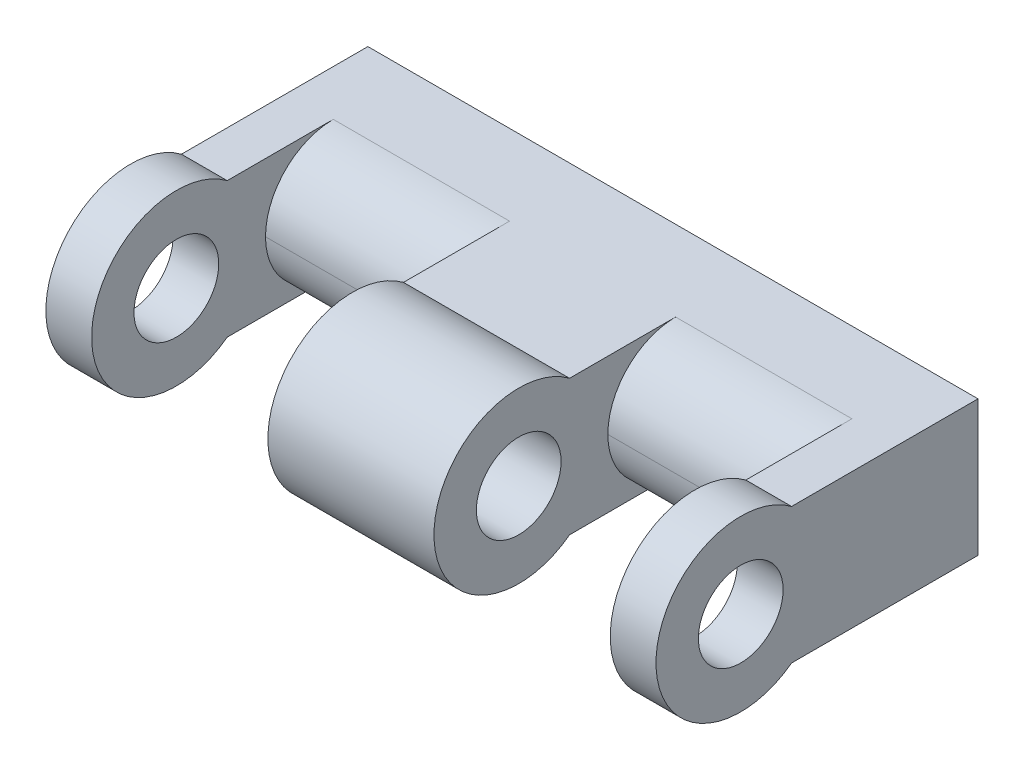
ISO-10303-21;
HEADER;
FILE_DESCRIPTION(('STEP AP214'),'2;1');
FILE_NAME('part.step','',(''),(''),'','','');
FILE_SCHEMA(('AUTOMOTIVE_DESIGN { 1 0 10303 214 1 1 1 1 }'));
ENDSEC;
DATA;
#1=APPLICATION_CONTEXT('core data for automotive mechanical design processes');
#2=APPLICATION_PROTOCOL_DEFINITION('international standard','automotive_design',2000,#1);
#3=PRODUCT_CONTEXT('',#1,'mechanical');
#4=PRODUCT('Part','Part','',(#3));
#5=PRODUCT_RELATED_PRODUCT_CATEGORY('part','',(#4));
#6=PRODUCT_DEFINITION_FORMATION('','',#4);
#7=PRODUCT_DEFINITION_CONTEXT('part definition',#1,'design');
#8=PRODUCT_DEFINITION('design','',#6,#7);
#9=PRODUCT_DEFINITION_SHAPE('','',#8);
#10=(LENGTH_UNIT() NAMED_UNIT(*) SI_UNIT(.MILLI.,.METRE.));
#11=(NAMED_UNIT(*) PLANE_ANGLE_UNIT() SI_UNIT($,.RADIAN.));
#12=(NAMED_UNIT(*) SI_UNIT($,.STERADIAN.) SOLID_ANGLE_UNIT());
#13=UNCERTAINTY_MEASURE_WITH_UNIT(LENGTH_MEASURE(1.E-05),#10,'distance_accuracy_value','');
#14=(GEOMETRIC_REPRESENTATION_CONTEXT(3) GLOBAL_UNCERTAINTY_ASSIGNED_CONTEXT((#13)) GLOBAL_UNIT_ASSIGNED_CONTEXT((#10,
#11,#12)) REPRESENTATION_CONTEXT('',''));
#15=CARTESIAN_POINT('',(0.,0.,0.));
#16=DIRECTION('',(0.,0.,1.));
#17=DIRECTION('',(1.,0.,0.));
#18=AXIS2_PLACEMENT_3D('',#15,#16,#17);
#19=CARTESIAN_POINT('',(0.,0.,56.));
#20=DIRECTION('',(0.,1.,0.));
#21=DIRECTION('',(0.,0.,1.));
#22=AXIS2_PLACEMENT_3D('',#19,#20,#21);
#23=PLANE('',#22);
#24=DIRECTION('',(0.,0.,-1.));
#25=VECTOR('',#24,1.);
#26=CARTESIAN_POINT('',(65.5,0.,55.));
#27=LINE('',#26,#25);
#28=CARTESIAN_POINT('',(65.5,0.,55.));
#29=VERTEX_POINT('',#28);
#30=CARTESIAN_POINT('',(65.5,0.,23.7013790098299));
#31=VERTEX_POINT('',#30);
#32=EDGE_CURVE('E186',#29,#31,#27,.T.);
#33=ORIENTED_EDGE('',*,*,#32,.T.);
#34=DIRECTION('',(1.,0.,0.));
#35=VECTOR('',#34,1.);
#36=CARTESIAN_POINT('',(0.,0.,23.7013790098299));
#37=LINE('',#36,#35);
#38=CARTESIAN_POINT('',(13.5,0.,23.7013790098299));
#39=VERTEX_POINT('',#38);
#40=EDGE_CURVE('E228',#31,#39,#37,.F.);
#41=ORIENTED_EDGE('',*,*,#40,.T.);
#42=DIRECTION('',(0.,0.,-1.));
#43=VECTOR('',#42,1.);
#44=CARTESIAN_POINT('',(13.5,0.,55.));
#45=LINE('',#44,#43);
#46=CARTESIAN_POINT('',(13.5,0.,55.));
#47=VERTEX_POINT('',#46);
#48=EDGE_CURVE('E185',#47,#39,#45,.T.);
#49=ORIENTED_EDGE('',*,*,#48,.F.);
#50=DIRECTION('',(-1.,0.,0.));
#51=VECTOR('',#50,1.);
#52=CARTESIAN_POINT('',(13.5,0.,55.));
#53=LINE('',#52,#51);
#54=CARTESIAN_POINT('',(0.,0.,55.));
#55=VERTEX_POINT('',#54);
#56=EDGE_CURVE('E195',#55,#47,#53,.F.);
#57=ORIENTED_EDGE('',*,*,#56,.F.);
#58=DIRECTION('',(0.,0.,-1.));
#59=VECTOR('',#58,1.);
#60=CARTESIAN_POINT('',(0.,0.,56.));
#61=LINE('',#60,#59);
#62=CARTESIAN_POINT('',(0.,0.,0.));
#63=VERTEX_POINT('',#62);
#64=EDGE_CURVE('E372',#55,#63,#61,.T.);
#65=ORIENTED_EDGE('',*,*,#64,.T.);
#66=DIRECTION('',(1.,0.,0.));
#67=VECTOR('',#66,1.);
#68=CARTESIAN_POINT('',(0.,0.,0.));
#69=LINE('',#68,#67);
#70=CARTESIAN_POINT('',(180.,0.,0.));
#71=VERTEX_POINT('',#70);
#72=EDGE_CURVE('E355',#63,#71,#69,.T.);
#73=ORIENTED_EDGE('',*,*,#72,.T.);
#74=DIRECTION('',(0.,0.,-1.));
#75=VECTOR('',#74,1.);
#76=CARTESIAN_POINT('',(180.,0.,56.));
#77=LINE('',#76,#75);
#78=CARTESIAN_POINT('',(180.,0.,55.));
#79=VERTEX_POINT('',#78);
#80=EDGE_CURVE('E282',#79,#71,#77,.T.);
#81=ORIENTED_EDGE('',*,*,#80,.F.);
#82=DIRECTION('',(1.,0.,0.));
#83=VECTOR('',#82,1.);
#84=CARTESIAN_POINT('',(166.5,0.,55.));
#85=LINE('',#84,#83);
#86=CARTESIAN_POINT('',(166.5,0.,55.));
#87=VERTEX_POINT('',#86);
#88=EDGE_CURVE('E280',#79,#87,#85,.F.);
#89=ORIENTED_EDGE('',*,*,#88,.T.);
#90=DIRECTION('',(0.,0.,-1.));
#91=VECTOR('',#90,1.);
#92=CARTESIAN_POINT('',(166.5,0.,55.));
#93=LINE('',#92,#91);
#94=CARTESIAN_POINT('',(166.5,0.,23.7013790098299));
#95=VERTEX_POINT('',#94);
#96=EDGE_CURVE('E270',#87,#95,#93,.T.);
#97=ORIENTED_EDGE('',*,*,#96,.T.);
#98=DIRECTION('',(-1.,0.,0.));
#99=VECTOR('',#98,1.);
#100=CARTESIAN_POINT('',(114.5,0.,23.7013790098299));
#101=LINE('',#100,#99);
#102=CARTESIAN_POINT('',(114.5,0.,23.7013790098299));
#103=VERTEX_POINT('',#102);
#104=EDGE_CURVE('E224',#95,#103,#101,.T.);
#105=ORIENTED_EDGE('',*,*,#104,.T.);
#106=DIRECTION('',(0.,0.,-1.));
#107=VECTOR('',#106,1.);
#108=CARTESIAN_POINT('',(114.5,0.,55.));
#109=LINE('',#108,#107);
#110=CARTESIAN_POINT('',(114.5,0.,55.));
#111=VERTEX_POINT('',#110);
#112=EDGE_CURVE('E406',#111,#103,#109,.T.);
#113=ORIENTED_EDGE('',*,*,#112,.F.);
#114=DIRECTION('',(-1.,0.,0.));
#115=VECTOR('',#114,1.);
#116=CARTESIAN_POINT('',(114.5,0.,55.));
#117=LINE('',#116,#115);
#118=EDGE_CURVE('E303',#29,#111,#117,.F.);
#119=ORIENTED_EDGE('',*,*,#118,.F.);
#120=EDGE_LOOP('',(#33,#41,#49,#57,#65,#73,#81,#89,#97,#105,#113,#119));
#121=FACE_BOUND('',#120,.T.);
#122=ADVANCED_FACE('F45',(#121),#23,.F.);
#123=CARTESIAN_POINT('',(0.,40.,56.));
#124=DIRECTION('',(0.,-1.,0.));
#125=DIRECTION('',(0.,0.,-1.));
#126=AXIS2_PLACEMENT_3D('',#123,#124,#125);
#127=PLANE('',#126);
#128=DIRECTION('',(1.,0.,0.));
#129=VECTOR('',#128,1.);
#130=CARTESIAN_POINT('',(0.,40.,23.7013790098299));
#131=LINE('',#130,#129);
#132=CARTESIAN_POINT('',(13.5,40.,23.7013790098299));
#133=VERTEX_POINT('',#132);
#134=CARTESIAN_POINT('',(65.5,40.,23.7013790098299));
#135=VERTEX_POINT('',#134);
#136=EDGE_CURVE('E209',#133,#135,#131,.T.);
#137=ORIENTED_EDGE('',*,*,#136,.T.);
#138=DIRECTION('',(0.,0.,1.));
#139=VECTOR('',#138,1.);
#140=CARTESIAN_POINT('',(65.5,40.,55.));
#141=LINE('',#140,#139);
#142=CARTESIAN_POINT('',(65.5,40.,55.));
#143=VERTEX_POINT('',#142);
#144=EDGE_CURVE('E253',#135,#143,#141,.T.);
#145=ORIENTED_EDGE('',*,*,#144,.T.);
#146=DIRECTION('',(-1.,0.,0.));
#147=VECTOR('',#146,1.);
#148=CARTESIAN_POINT('',(114.5,40.,55.));
#149=LINE('',#148,#147);
#150=CARTESIAN_POINT('',(114.5,40.,55.));
#151=VERTEX_POINT('',#150);
#152=EDGE_CURVE('E211',#151,#143,#149,.T.);
#153=ORIENTED_EDGE('',*,*,#152,.F.);
#154=DIRECTION('',(0.,0.,1.));
#155=VECTOR('',#154,1.);
#156=CARTESIAN_POINT('',(114.5,40.,55.));
#157=LINE('',#156,#155);
#158=CARTESIAN_POINT('',(114.5,40.,23.7013790098299));
#159=VERTEX_POINT('',#158);
#160=EDGE_CURVE('E277',#159,#151,#157,.T.);
#161=ORIENTED_EDGE('',*,*,#160,.F.);
#162=DIRECTION('',(-1.,0.,0.));
#163=VECTOR('',#162,1.);
#164=CARTESIAN_POINT('',(166.5,40.,23.7013790098299));
#165=LINE('',#164,#163);
#166=CARTESIAN_POINT('',(166.5,40.,23.7013790098299));
#167=VERTEX_POINT('',#166);
#168=EDGE_CURVE('E203',#159,#167,#165,.F.);
#169=ORIENTED_EDGE('',*,*,#168,.T.);
#170=DIRECTION('',(0.,0.,1.));
#171=VECTOR('',#170,1.);
#172=CARTESIAN_POINT('',(166.5,40.,55.));
#173=LINE('',#172,#171);
#174=CARTESIAN_POINT('',(166.5,40.,55.));
#175=VERTEX_POINT('',#174);
#176=EDGE_CURVE('E276',#167,#175,#173,.T.);
#177=ORIENTED_EDGE('',*,*,#176,.T.);
#178=DIRECTION('',(1.,0.,0.));
#179=VECTOR('',#178,1.);
#180=CARTESIAN_POINT('',(166.5,40.,55.));
#181=LINE('',#180,#179);
#182=CARTESIAN_POINT('',(180.,40.,55.));
#183=VERTEX_POINT('',#182);
#184=EDGE_CURVE('E204',#175,#183,#181,.T.);
#185=ORIENTED_EDGE('',*,*,#184,.T.);
#186=DIRECTION('',(0.,0.,-1.));
#187=VECTOR('',#186,1.);
#188=CARTESIAN_POINT('',(180.,40.,56.));
#189=LINE('',#188,#187);
#190=CARTESIAN_POINT('',(180.,40.,0.));
#191=VERTEX_POINT('',#190);
#192=EDGE_CURVE('E367',#183,#191,#189,.T.);
#193=ORIENTED_EDGE('',*,*,#192,.T.);
#194=DIRECTION('',(-1.,0.,0.));
#195=VECTOR('',#194,1.);
#196=CARTESIAN_POINT('',(0.,40.,0.));
#197=LINE('',#196,#195);
#198=CARTESIAN_POINT('',(0.,40.,0.));
#199=VERTEX_POINT('',#198);
#200=EDGE_CURVE('E362',#191,#199,#197,.T.);
#201=ORIENTED_EDGE('',*,*,#200,.T.);
#202=DIRECTION('',(0.,0.,-1.));
#203=VECTOR('',#202,1.);
#204=CARTESIAN_POINT('',(0.,40.,56.));
#205=LINE('',#204,#203);
#206=CARTESIAN_POINT('',(0.,40.,55.));
#207=VERTEX_POINT('',#206);
#208=EDGE_CURVE('E201',#207,#199,#205,.T.);
#209=ORIENTED_EDGE('',*,*,#208,.F.);
#210=DIRECTION('',(-1.,0.,0.));
#211=VECTOR('',#210,1.);
#212=CARTESIAN_POINT('',(13.5,40.,55.));
#213=LINE('',#212,#211);
#214=CARTESIAN_POINT('',(13.5000000000001,40.,55.));
#215=VERTEX_POINT('',#214);
#216=EDGE_CURVE('E192',#215,#207,#213,.T.);
#217=ORIENTED_EDGE('',*,*,#216,.F.);
#218=DIRECTION('',(0.,0.,1.));
#219=VECTOR('',#218,1.);
#220=CARTESIAN_POINT('',(13.5,40.,55.));
#221=LINE('',#220,#219);
#222=EDGE_CURVE('E173',#133,#215,#221,.T.);
#223=ORIENTED_EDGE('',*,*,#222,.F.);
#224=EDGE_LOOP('',(#137,#145,#153,#161,#169,#177,#185,#193,#201,#209,#217,#223));
#225=FACE_BOUND('',#224,.T.);
#226=ADVANCED_FACE('F199',(#225),#127,.F.);
#227=CARTESIAN_POINT('',(0.,0.,56.));
#228=DIRECTION('',(1.,0.,0.));
#229=DIRECTION('',(0.,0.,-1.));
#230=AXIS2_PLACEMENT_3D('',#227,#228,#229);
#231=PLANE('',#230);
#232=CARTESIAN_POINT('',(0.,20.,70.));
#233=DIRECTION('',(1.,0.,0.));
#234=DIRECTION('',(0.,0.,-1.));
#235=AXIS2_PLACEMENT_3D('',#232,#233,#234);
#236=CIRCLE('',#235,12.5);
#237=CARTESIAN_POINT('',(0.,20.,82.5));
#238=VERTEX_POINT('',#237);
#239=EDGE_CURVE('E220',#238,#238,#236,.T.);
#240=ORIENTED_EDGE('',*,*,#239,.T.);
#241=EDGE_LOOP('',(#240));
#242=FACE_BOUND('',#241,.T.);
#243=ORIENTED_EDGE('',*,*,#64,.F.);
#244=CARTESIAN_POINT('',(0.,20.,70.));
#245=DIRECTION('',(1.,0.,0.));
#246=DIRECTION('',(0.,0.,-1.));
#247=AXIS2_PLACEMENT_3D('',#244,#245,#246);
#248=CIRCLE('',#247,25.);
#249=EDGE_CURVE('E197',#207,#55,#248,.T.);
#250=ORIENTED_EDGE('',*,*,#249,.F.);
#251=ORIENTED_EDGE('',*,*,#208,.T.);
#252=DIRECTION('',(0.,-1.,0.));
#253=VECTOR('',#252,1.);
#254=CARTESIAN_POINT('',(0.,0.,0.));
#255=LINE('',#254,#253);
#256=EDGE_CURVE('E342',#199,#63,#255,.T.);
#257=ORIENTED_EDGE('',*,*,#256,.T.);
#258=EDGE_LOOP('',(#243,#250,#251,#257));
#259=FACE_BOUND('',#258,.T.);
#260=ADVANCED_FACE('F435',(#242,#259),#231,.F.);
#261=CARTESIAN_POINT('',(180.,0.,56.));
#262=DIRECTION('',(-1.,0.,0.));
#263=DIRECTION('',(0.,0.,1.));
#264=AXIS2_PLACEMENT_3D('',#261,#262,#263);
#265=PLANE('',#264);
#266=CARTESIAN_POINT('',(180.,20.,70.));
#267=DIRECTION('',(1.,0.,0.));
#268=DIRECTION('',(0.,0.,-1.));
#269=AXIS2_PLACEMENT_3D('',#266,#267,#268);
#270=CIRCLE('',#269,12.5);
#271=CARTESIAN_POINT('',(180.,20.,57.5));
#272=VERTEX_POINT('',#271);
#273=EDGE_CURVE('E389',#272,#272,#270,.T.);
#274=ORIENTED_EDGE('',*,*,#273,.F.);
#275=EDGE_LOOP('',(#274));
#276=FACE_BOUND('',#275,.T.);
#277=CARTESIAN_POINT('',(180.,20.,70.));
#278=DIRECTION('',(1.,0.,0.));
#279=DIRECTION('',(0.,0.,-1.));
#280=AXIS2_PLACEMENT_3D('',#277,#278,#279);
#281=CIRCLE('',#280,25.);
#282=EDGE_CURVE('E292',#183,#79,#281,.T.);
#283=ORIENTED_EDGE('',*,*,#282,.T.);
#284=ORIENTED_EDGE('',*,*,#80,.T.);
#285=DIRECTION('',(0.,1.,0.));
#286=VECTOR('',#285,1.);
#287=CARTESIAN_POINT('',(180.,0.,0.));
#288=LINE('',#287,#286);
#289=EDGE_CURVE('E358',#71,#191,#288,.T.);
#290=ORIENTED_EDGE('',*,*,#289,.T.);
#291=ORIENTED_EDGE('',*,*,#192,.F.);
#292=EDGE_LOOP('',(#283,#284,#290,#291));
#293=FACE_BOUND('',#292,.T.);
#294=ADVANCED_FACE('F438',(#276,#293),#265,.F.);
#295=CARTESIAN_POINT('',(0.,0.,0.));
#296=DIRECTION('',(0.,0.,-1.));
#297=DIRECTION('',(-1.,0.,0.));
#298=AXIS2_PLACEMENT_3D('',#295,#296,#297);
#299=PLANE('',#298);
#300=DIRECTION('',(0.,-1.,0.));
#301=VECTOR('',#300,1.);
#302=CARTESIAN_POINT('',(165.,15.,0.));
#303=LINE('',#302,#301);
#304=CARTESIAN_POINT('',(165.,25.,0.));
#305=VERTEX_POINT('',#304);
#306=CARTESIAN_POINT('',(165.,15.,0.));
#307=VERTEX_POINT('',#306);
#308=EDGE_CURVE('E307',#305,#307,#303,.T.);
#309=ORIENTED_EDGE('',*,*,#308,.F.);
#310=DIRECTION('',(1.,0.,0.));
#311=VECTOR('',#310,1.);
#312=CARTESIAN_POINT('',(165.,25.,0.));
#313=LINE('',#312,#311);
#314=CARTESIAN_POINT('',(15.,25.,0.));
#315=VERTEX_POINT('',#314);
#316=EDGE_CURVE('E313',#315,#305,#313,.T.);
#317=ORIENTED_EDGE('',*,*,#316,.F.);
#318=DIRECTION('',(0.,1.,0.));
#319=VECTOR('',#318,1.);
#320=CARTESIAN_POINT('',(15.,15.,0.));
#321=LINE('',#320,#319);
#322=CARTESIAN_POINT('',(15.,15.,0.));
#323=VERTEX_POINT('',#322);
#324=EDGE_CURVE('E332',#323,#315,#321,.T.);
#325=ORIENTED_EDGE('',*,*,#324,.F.);
#326=DIRECTION('',(-1.,0.,0.));
#327=VECTOR('',#326,1.);
#328=CARTESIAN_POINT('',(165.,15.,0.));
#329=LINE('',#328,#327);
#330=EDGE_CURVE('E328',#307,#323,#329,.T.);
#331=ORIENTED_EDGE('',*,*,#330,.F.);
#332=EDGE_LOOP('',(#309,#317,#325,#331));
#333=FACE_BOUND('',#332,.T.);
#334=ORIENTED_EDGE('',*,*,#256,.F.);
#335=ORIENTED_EDGE('',*,*,#200,.F.);
#336=ORIENTED_EDGE('',*,*,#289,.F.);
#337=ORIENTED_EDGE('',*,*,#72,.F.);
#338=EDGE_LOOP('',(#334,#335,#336,#337));
#339=FACE_BOUND('',#338,.T.);
#340=ADVANCED_FACE('F446',(#333,#339),#299,.T.);
#341=CARTESIAN_POINT('',(165.,15.,40.));
#342=DIRECTION('',(1.,0.,0.));
#343=DIRECTION('',(0.,0.,-1.));
#344=AXIS2_PLACEMENT_3D('',#341,#342,#343);
#345=PLANE('',#344);
#346=ORIENTED_EDGE('',*,*,#308,.T.);
#347=DIRECTION('',(0.,0.,-1.));
#348=VECTOR('',#347,1.);
#349=CARTESIAN_POINT('',(165.,15.,40.));
#350=LINE('',#349,#348);
#351=CARTESIAN_POINT('',(165.,15.,40.));
#352=VERTEX_POINT('',#351);
#353=EDGE_CURVE('E325',#352,#307,#350,.T.);
#354=ORIENTED_EDGE('',*,*,#353,.F.);
#355=DIRECTION('',(0.,-1.,0.));
#356=VECTOR('',#355,1.);
#357=CARTESIAN_POINT('',(165.,15.,40.));
#358=LINE('',#357,#356);
#359=CARTESIAN_POINT('',(165.,25.,40.));
#360=VERTEX_POINT('',#359);
#361=EDGE_CURVE('E308',#360,#352,#358,.T.);
#362=ORIENTED_EDGE('',*,*,#361,.F.);
#363=DIRECTION('',(0.,0.,-1.));
#364=VECTOR('',#363,1.);
#365=CARTESIAN_POINT('',(165.,25.,40.));
#366=LINE('',#365,#364);
#367=EDGE_CURVE('E339',#360,#305,#366,.T.);
#368=ORIENTED_EDGE('',*,*,#367,.T.);
#369=EDGE_LOOP('',(#346,#354,#362,#368));
#370=FACE_BOUND('',#369,.T.);
#371=ADVANCED_FACE('F494',(#370),#345,.F.);
#372=CARTESIAN_POINT('',(165.,25.,40.));
#373=DIRECTION('',(0.,1.,0.));
#374=DIRECTION('',(0.,0.,1.));
#375=AXIS2_PLACEMENT_3D('',#372,#373,#374);
#376=PLANE('',#375);
#377=ORIENTED_EDGE('',*,*,#316,.T.);
#378=ORIENTED_EDGE('',*,*,#367,.F.);
#379=DIRECTION('',(1.,0.,0.));
#380=VECTOR('',#379,1.);
#381=CARTESIAN_POINT('',(165.,25.,40.));
#382=LINE('',#381,#380);
#383=CARTESIAN_POINT('',(15.,25.,40.));
#384=VERTEX_POINT('',#383);
#385=EDGE_CURVE('E321',#384,#360,#382,.T.);
#386=ORIENTED_EDGE('',*,*,#385,.F.);
#387=DIRECTION('',(0.,0.,-1.));
#388=VECTOR('',#387,1.);
#389=CARTESIAN_POINT('',(15.,25.,40.));
#390=LINE('',#389,#388);
#391=EDGE_CURVE('E343',#384,#315,#390,.T.);
#392=ORIENTED_EDGE('',*,*,#391,.T.);
#393=EDGE_LOOP('',(#377,#378,#386,#392));
#394=FACE_BOUND('',#393,.T.);
#395=ADVANCED_FACE('F490',(#394),#376,.F.);
#396=CARTESIAN_POINT('',(15.,15.,40.));
#397=DIRECTION('',(-1.,0.,0.));
#398=DIRECTION('',(0.,-1.,0.));
#399=AXIS2_PLACEMENT_3D('',#396,#397,#398);
#400=PLANE('',#399);
#401=ORIENTED_EDGE('',*,*,#324,.T.);
#402=ORIENTED_EDGE('',*,*,#391,.F.);
#403=DIRECTION('',(0.,1.,0.));
#404=VECTOR('',#403,1.);
#405=CARTESIAN_POINT('',(15.,15.,40.));
#406=LINE('',#405,#404);
#407=CARTESIAN_POINT('',(15.,15.,40.));
#408=VERTEX_POINT('',#407);
#409=EDGE_CURVE('E317',#408,#384,#406,.T.);
#410=ORIENTED_EDGE('',*,*,#409,.F.);
#411=DIRECTION('',(0.,0.,-1.));
#412=VECTOR('',#411,1.);
#413=CARTESIAN_POINT('',(15.,15.,40.));
#414=LINE('',#413,#412);
#415=EDGE_CURVE('E346',#408,#323,#414,.T.);
#416=ORIENTED_EDGE('',*,*,#415,.T.);
#417=EDGE_LOOP('',(#401,#402,#410,#416));
#418=FACE_BOUND('',#417,.T.);
#419=ADVANCED_FACE('F493',(#418),#400,.F.);
#420=CARTESIAN_POINT('',(165.,15.,40.));
#421=DIRECTION('',(0.,-1.,0.));
#422=DIRECTION('',(0.,0.,-1.));
#423=AXIS2_PLACEMENT_3D('',#420,#421,#422);
#424=PLANE('',#423);
#425=ORIENTED_EDGE('',*,*,#330,.T.);
#426=ORIENTED_EDGE('',*,*,#415,.F.);
#427=DIRECTION('',(-1.,0.,0.));
#428=VECTOR('',#427,1.);
#429=CARTESIAN_POINT('',(165.,15.,40.));
#430=LINE('',#429,#428);
#431=EDGE_CURVE('E312',#352,#408,#430,.T.);
#432=ORIENTED_EDGE('',*,*,#431,.F.);
#433=ORIENTED_EDGE('',*,*,#353,.T.);
#434=EDGE_LOOP('',(#425,#426,#432,#433));
#435=FACE_BOUND('',#434,.T.);
#436=ADVANCED_FACE('F488',(#435),#424,.F.);
#437=CARTESIAN_POINT('',(0.,0.,40.));
#438=DIRECTION('',(0.,0.,1.));
#439=DIRECTION('',(1.,0.,0.));
#440=AXIS2_PLACEMENT_3D('',#437,#438,#439);
#441=PLANE('',#440);
#442=ORIENTED_EDGE('',*,*,#361,.T.);
#443=ORIENTED_EDGE('',*,*,#431,.T.);
#444=ORIENTED_EDGE('',*,*,#409,.T.);
#445=ORIENTED_EDGE('',*,*,#385,.T.);
#446=EDGE_LOOP('',(#442,#443,#444,#445));
#447=FACE_BOUND('',#446,.T.);
#448=ADVANCED_FACE('F485',(#447),#441,.F.);
#449=CARTESIAN_POINT('',(114.5,20.,70.));
#450=DIRECTION('',(-1.,0.,0.));
#451=DIRECTION('',(0.,0.,1.));
#452=AXIS2_PLACEMENT_3D('',#449,#450,#451);
#453=CYLINDRICAL_SURFACE('',#452,25.);
#454=ORIENTED_EDGE('',*,*,#152,.T.);
#455=CARTESIAN_POINT('',(65.5,20.,70.));
#456=DIRECTION('',(1.,0.,0.));
#457=DIRECTION('',(0.,0.,-1.));
#458=AXIS2_PLACEMENT_3D('',#455,#456,#457);
#459=CIRCLE('',#458,25.);
#460=EDGE_CURVE('E383',#143,#29,#459,.T.);
#461=ORIENTED_EDGE('',*,*,#460,.T.);
#462=ORIENTED_EDGE('',*,*,#118,.T.);
#463=CARTESIAN_POINT('',(114.5,20.,70.));
#464=DIRECTION('',(1.,0.,0.));
#465=DIRECTION('',(0.,0.,-1.));
#466=AXIS2_PLACEMENT_3D('',#463,#464,#465);
#467=CIRCLE('',#466,25.);
#468=EDGE_CURVE('E287',#151,#111,#467,.T.);
#469=ORIENTED_EDGE('',*,*,#468,.F.);
#470=EDGE_LOOP('',(#454,#461,#462,#469));
#471=FACE_BOUND('',#470,.T.);
#472=ADVANCED_FACE('F382',(#471),#453,.T.);
#473=CARTESIAN_POINT('',(114.5,20.,70.));
#474=DIRECTION('',(1.,0.,0.));
#475=DIRECTION('',(0.,0.,-1.));
#476=AXIS2_PLACEMENT_3D('',#473,#474,#475);
#477=PLANE('',#476);
#478=ORIENTED_EDGE('',*,*,#468,.T.);
#479=ORIENTED_EDGE('',*,*,#112,.T.);
#480=CARTESIAN_POINT('',(114.5,20.,23.7013790098299));
#481=DIRECTION('',(1.,0.,0.));
#482=DIRECTION('',(0.,0.,-1.));
#483=AXIS2_PLACEMENT_3D('',#480,#481,#482);
#484=CIRCLE('',#483,20.);
#485=CARTESIAN_POINT('',(114.5,20.,43.7013790098299));
#486=VERTEX_POINT('',#485);
#487=EDGE_CURVE('E55',#103,#486,#484,.F.);
#488=ORIENTED_EDGE('',*,*,#487,.T.);
#489=CARTESIAN_POINT('',(114.5,20.,23.7013790098299));
#490=DIRECTION('',(1.,0.,0.));
#491=DIRECTION('',(0.,0.,-1.));
#492=AXIS2_PLACEMENT_3D('',#489,#490,#491);
#493=CIRCLE('',#492,20.);
#494=EDGE_CURVE('E244',#486,#159,#493,.F.);
#495=ORIENTED_EDGE('',*,*,#494,.T.);
#496=ORIENTED_EDGE('',*,*,#160,.T.);
#497=EDGE_LOOP('',(#478,#479,#488,#495,#496));
#498=FACE_BOUND('',#497,.T.);
#499=CARTESIAN_POINT('',(114.5,20.,70.));
#500=DIRECTION('',(1.,0.,0.));
#501=DIRECTION('',(0.,0.,-1.));
#502=AXIS2_PLACEMENT_3D('',#499,#500,#501);
#503=CIRCLE('',#502,12.5);
#504=CARTESIAN_POINT('',(114.5,20.,57.5));
#505=VERTEX_POINT('',#504);
#506=EDGE_CURVE('E295',#505,#505,#503,.T.);
#507=ORIENTED_EDGE('',*,*,#506,.F.);
#508=EDGE_LOOP('',(#507));
#509=FACE_BOUND('',#508,.T.);
#510=ADVANCED_FACE('F458',(#498,#509),#477,.T.);
#511=CARTESIAN_POINT('',(166.5,20.,70.));
#512=DIRECTION('',(1.,0.,0.));
#513=DIRECTION('',(0.,0.,-1.));
#514=AXIS2_PLACEMENT_3D('',#511,#512,#513);
#515=CYLINDRICAL_SURFACE('',#514,25.);
#516=ORIENTED_EDGE('',*,*,#88,.F.);
#517=ORIENTED_EDGE('',*,*,#282,.F.);
#518=ORIENTED_EDGE('',*,*,#184,.F.);
#519=CARTESIAN_POINT('',(166.5,20.,70.));
#520=DIRECTION('',(1.,0.,0.));
#521=DIRECTION('',(0.,0.,-1.));
#522=AXIS2_PLACEMENT_3D('',#519,#520,#521);
#523=CIRCLE('',#522,25.);
#524=EDGE_CURVE('E273',#175,#87,#523,.T.);
#525=ORIENTED_EDGE('',*,*,#524,.T.);
#526=EDGE_LOOP('',(#516,#517,#518,#525));
#527=FACE_BOUND('',#526,.T.);
#528=ADVANCED_FACE('F290',(#527),#515,.T.);
#529=CARTESIAN_POINT('',(166.5,20.,70.));
#530=DIRECTION('',(1.,0.,0.));
#531=DIRECTION('',(0.,0.,-1.));
#532=AXIS2_PLACEMENT_3D('',#529,#530,#531);
#533=PLANE('',#532);
#534=ORIENTED_EDGE('',*,*,#96,.F.);
#535=ORIENTED_EDGE('',*,*,#524,.F.);
#536=ORIENTED_EDGE('',*,*,#176,.F.);
#537=CARTESIAN_POINT('',(166.5,20.,23.7013790098299));
#538=DIRECTION('',(1.,0.,0.));
#539=DIRECTION('',(0.,0.,-1.));
#540=AXIS2_PLACEMENT_3D('',#537,#538,#539);
#541=CIRCLE('',#540,20.);
#542=CARTESIAN_POINT('',(166.5,20.,43.7013790098299));
#543=VERTEX_POINT('',#542);
#544=EDGE_CURVE('E62',#167,#543,#541,.T.);
#545=ORIENTED_EDGE('',*,*,#544,.T.);
#546=CARTESIAN_POINT('',(166.5,20.,23.7013790098299));
#547=DIRECTION('',(1.,0.,0.));
#548=DIRECTION('',(0.,0.,-1.));
#549=AXIS2_PLACEMENT_3D('',#546,#547,#548);
#550=CIRCLE('',#549,20.);
#551=EDGE_CURVE('E11',#543,#95,#550,.T.);
#552=ORIENTED_EDGE('',*,*,#551,.T.);
#553=EDGE_LOOP('',(#534,#535,#536,#545,#552));
#554=FACE_BOUND('',#553,.T.);
#555=CARTESIAN_POINT('',(166.5,20.,70.));
#556=DIRECTION('',(1.,0.,0.));
#557=DIRECTION('',(0.,0.,-1.));
#558=AXIS2_PLACEMENT_3D('',#555,#556,#557);
#559=CIRCLE('',#558,12.5);
#560=CARTESIAN_POINT('',(166.5,20.,57.5));
#561=VERTEX_POINT('',#560);
#562=EDGE_CURVE('E215',#561,#561,#559,.T.);
#563=ORIENTED_EDGE('',*,*,#562,.T.);
#564=EDGE_LOOP('',(#563));
#565=FACE_BOUND('',#564,.T.);
#566=ADVANCED_FACE('F267',(#554,#565),#533,.F.);
#567=CARTESIAN_POINT('',(90.,20.,70.));
#568=DIRECTION('',(1.,0.,0.));
#569=DIRECTION('',(0.,0.,-1.));
#570=AXIS2_PLACEMENT_3D('',#567,#568,#569);
#571=CYLINDRICAL_SURFACE('',#570,12.5);
#572=CARTESIAN_POINT('',(180.,20.,57.5));
#573=CARTESIAN_POINT('',(179.859375,20.,57.5));
#574=CARTESIAN_POINT('',(179.71875,20.,57.5));
#575=CARTESIAN_POINT('',(179.4375,20.,57.5));
#576=CARTESIAN_POINT('',(179.296875,20.,57.5));
#577=CARTESIAN_POINT('',(179.015625,20.,57.5));
#578=CARTESIAN_POINT('',(178.875,20.,57.5));
#579=CARTESIAN_POINT('',(178.59375,20.,57.5));
#580=CARTESIAN_POINT('',(178.453125,20.,57.5));
#581=CARTESIAN_POINT('',(178.171875,20.,57.5));
#582=CARTESIAN_POINT('',(178.03125,20.,57.5));
#583=CARTESIAN_POINT('',(177.75,20.,57.5));
#584=CARTESIAN_POINT('',(177.609375,20.,57.5));
#585=CARTESIAN_POINT('',(177.328125,20.,57.5));
#586=CARTESIAN_POINT('',(177.1875,20.,57.5));
#587=CARTESIAN_POINT('',(176.90625,20.,57.5));
#588=CARTESIAN_POINT('',(176.765625,20.,57.5));
#589=CARTESIAN_POINT('',(176.484375,20.,57.5));
#590=CARTESIAN_POINT('',(176.34375,20.,57.5));
#591=CARTESIAN_POINT('',(176.0625,20.,57.5));
#592=CARTESIAN_POINT('',(175.921875,20.,57.5));
#593=CARTESIAN_POINT('',(175.640625,20.,57.5));
#594=CARTESIAN_POINT('',(175.5,20.,57.5));
#595=CARTESIAN_POINT('',(175.21875,20.,57.5));
#596=CARTESIAN_POINT('',(175.078125,20.,57.5));
#597=CARTESIAN_POINT('',(174.796875,20.,57.5));
#598=CARTESIAN_POINT('',(174.65625,20.,57.5));
#599=CARTESIAN_POINT('',(174.375,20.,57.5));
#600=CARTESIAN_POINT('',(174.234375,20.,57.5));
#601=CARTESIAN_POINT('',(173.953125,20.,57.5));
#602=CARTESIAN_POINT('',(173.8125,20.,57.5));
#603=CARTESIAN_POINT('',(173.53125,20.,57.5));
#604=CARTESIAN_POINT('',(173.390625,20.,57.5));
#605=CARTESIAN_POINT('',(173.109375,20.,57.5));
#606=CARTESIAN_POINT('',(172.96875,20.,57.5));
#607=CARTESIAN_POINT('',(172.6875,20.,57.5));
#608=CARTESIAN_POINT('',(172.546875,20.,57.5));
#609=CARTESIAN_POINT('',(172.265625,20.,57.5));
#610=CARTESIAN_POINT('',(172.125,20.,57.5));
#611=CARTESIAN_POINT('',(171.84375,20.,57.5));
#612=CARTESIAN_POINT('',(171.703125,20.,57.5));
#613=CARTESIAN_POINT('',(171.421875,20.,57.5));
#614=CARTESIAN_POINT('',(171.28125,20.,57.5));
#615=CARTESIAN_POINT('',(171.,20.,57.5));
#616=CARTESIAN_POINT('',(170.859375,20.,57.5));
#617=CARTESIAN_POINT('',(170.578125,20.,57.5));
#618=CARTESIAN_POINT('',(170.4375,20.,57.5));
#619=CARTESIAN_POINT('',(170.15625,20.,57.5));
#620=CARTESIAN_POINT('',(170.015625,20.,57.5));
#621=CARTESIAN_POINT('',(169.734375,20.,57.5));
#622=CARTESIAN_POINT('',(169.59375,20.,57.5));
#623=CARTESIAN_POINT('',(169.3125,20.,57.5));
#624=CARTESIAN_POINT('',(169.171875,20.,57.5));
#625=CARTESIAN_POINT('',(168.890625,20.,57.5));
#626=CARTESIAN_POINT('',(168.75,20.,57.5));
#627=CARTESIAN_POINT('',(168.46875,20.,57.5));
#628=CARTESIAN_POINT('',(168.328125,20.,57.5));
#629=CARTESIAN_POINT('',(168.046875,20.,57.5));
#630=CARTESIAN_POINT('',(167.90625,20.,57.5));
#631=CARTESIAN_POINT('',(167.625,20.,57.5));
#632=CARTESIAN_POINT('',(167.484375,20.,57.5));
#633=CARTESIAN_POINT('',(167.203125,20.,57.5));
#634=CARTESIAN_POINT('',(167.0625,20.,57.5));
#635=CARTESIAN_POINT('',(166.78125,20.,57.5));
#636=CARTESIAN_POINT('',(166.640625,20.,57.5));
#637=CARTESIAN_POINT('',(166.5,20.,57.5));
#638=B_SPLINE_CURVE_WITH_KNOTS('',3,(#572,#573,#574,#575,#576,#577,#578,#579,#580,#581,#582,
#583,#584,#585,#586,#587,#588,#589,#590,#591,#592,#593,#594,#595,#596,#597,#598,#599,#600,#601,
#602,#603,#604,#605,#606,#607,#608,#609,#610,#611,#612,#613,#614,#615,#616,#617,#618,#619,#620,
#621,#622,#623,#624,#625,#626,#627,#628,#629,#630,#631,#632,#633,#634,#635,#636,#637),
.UNSPECIFIED.,.F.,.F.,(4,2,2,2,2,2,2,2,2,2,2,2,2,2,2,2,2,2,2,2,2,2,2,2,2,2,2,2,2,2,2,2,4),(0.,
0.421875000000016,0.843750000000032,1.26562500000002,1.68750000000001,2.10937500000002,
2.53125000000001,2.953125,3.37500000000002,3.79687500000003,4.21875000000002,4.64062500000001,
5.06250000000002,5.48437500000001,5.90625,6.32812500000002,6.75000000000003,7.17187500000002,
7.59375000000001,8.01562500000003,8.43750000000004,8.859375,9.28125000000002,9.70312500000004,
10.125,10.546875,10.96875,11.390625,11.8125,12.234375,12.65625,13.078125,13.5),.UNSPECIFIED.);
#639=EDGE_CURVE('BSEAM470',#272,#561,#638,.T.);
#640=ORIENTED_EDGE('',*,*,#273,.T.);
#641=ORIENTED_EDGE('',*,*,#562,.F.);
#642=ORIENTED_EDGE('',*,*,#639,.T.);
#643=ORIENTED_EDGE('',*,*,#639,.F.);
#644=EDGE_LOOP('',(#640,#642,#641,#643));
#645=FACE_BOUND('',#644,.T.);
#646=ADVANCED_FACE('F470',(#645),#571,.F.);
#647=CARTESIAN_POINT('',(65.5,20.,70.));
#648=DIRECTION('',(-1.,0.,0.));
#649=DIRECTION('',(0.,0.,1.));
#650=AXIS2_PLACEMENT_3D('',#647,#648,#649);
#651=CIRCLE('',#650,12.5);
#652=CARTESIAN_POINT('',(65.5,20.,57.5));
#653=VERTEX_POINT('',#652);
#654=EDGE_CURVE('E219',#653,#653,#651,.F.);
#655=CARTESIAN_POINT('',(114.5,20.,57.5));
#656=CARTESIAN_POINT('',(113.989583333333,20.,57.5));
#657=CARTESIAN_POINT('',(113.479166666667,20.,57.5));
#658=CARTESIAN_POINT('',(112.458333333333,20.,57.5));
#659=CARTESIAN_POINT('',(111.947916666667,20.,57.5));
#660=CARTESIAN_POINT('',(110.927083333333,20.,57.5));
#661=CARTESIAN_POINT('',(110.416666666667,20.,57.5));
#662=CARTESIAN_POINT('',(109.395833333333,20.,57.5));
#663=CARTESIAN_POINT('',(108.885416666667,20.,57.5));
#664=CARTESIAN_POINT('',(107.864583333333,20.,57.5));
#665=CARTESIAN_POINT('',(107.354166666667,20.,57.5));
#666=CARTESIAN_POINT('',(106.333333333333,20.,57.5));
#667=CARTESIAN_POINT('',(105.822916666667,20.,57.5));
#668=CARTESIAN_POINT('',(104.802083333333,20.,57.5));
#669=CARTESIAN_POINT('',(104.291666666667,20.,57.5));
#670=CARTESIAN_POINT('',(103.270833333333,20.,57.5));
#671=CARTESIAN_POINT('',(102.760416666667,20.,57.5));
#672=CARTESIAN_POINT('',(101.739583333333,20.,57.5));
#673=CARTESIAN_POINT('',(101.229166666667,20.,57.5));
#674=CARTESIAN_POINT('',(100.208333333333,20.,57.5));
#675=CARTESIAN_POINT('',(99.6979166666666,20.,57.5));
#676=CARTESIAN_POINT('',(98.6770833333333,20.,57.5));
#677=CARTESIAN_POINT('',(98.1666666666667,20.,57.5));
#678=CARTESIAN_POINT('',(97.1458333333333,20.,57.5));
#679=CARTESIAN_POINT('',(96.6354166666667,20.,57.5));
#680=CARTESIAN_POINT('',(95.6145833333333,20.,57.5));
#681=CARTESIAN_POINT('',(95.1041666666667,20.,57.5));
#682=CARTESIAN_POINT('',(94.0833333333333,20.,57.5));
#683=CARTESIAN_POINT('',(93.5729166666667,20.,57.5));
#684=CARTESIAN_POINT('',(92.5520833333333,20.,57.5));
#685=CARTESIAN_POINT('',(92.0416666666667,20.,57.5));
#686=CARTESIAN_POINT('',(91.0208333333333,20.,57.5));
#687=CARTESIAN_POINT('',(90.5104166666667,20.,57.5));
#688=CARTESIAN_POINT('',(89.4895833333333,20.,57.5));
#689=CARTESIAN_POINT('',(88.9791666666667,20.,57.5));
#690=CARTESIAN_POINT('',(87.9583333333333,20.,57.5));
#691=CARTESIAN_POINT('',(87.4479166666667,20.,57.5));
#692=CARTESIAN_POINT('',(86.4270833333333,20.,57.5));
#693=CARTESIAN_POINT('',(85.9166666666667,20.,57.5));
#694=CARTESIAN_POINT('',(84.8958333333333,20.,57.5));
#695=CARTESIAN_POINT('',(84.3854166666667,20.,57.5));
#696=CARTESIAN_POINT('',(83.3645833333333,20.,57.5));
#697=CARTESIAN_POINT('',(82.8541666666667,20.,57.5));
#698=CARTESIAN_POINT('',(81.8333333333333,20.,57.5));
#699=CARTESIAN_POINT('',(81.3229166666667,20.,57.5));
#700=CARTESIAN_POINT('',(80.3020833333333,20.,57.5));
#701=CARTESIAN_POINT('',(79.7916666666667,20.,57.5));
#702=CARTESIAN_POINT('',(78.7708333333333,20.,57.5));
#703=CARTESIAN_POINT('',(78.2604166666667,20.,57.5));
#704=CARTESIAN_POINT('',(77.2395833333333,20.,57.5));
#705=CARTESIAN_POINT('',(76.7291666666667,20.,57.5));
#706=CARTESIAN_POINT('',(75.7083333333333,20.,57.5));
#707=CARTESIAN_POINT('',(75.1979166666667,20.,57.5));
#708=CARTESIAN_POINT('',(74.1770833333333,20.,57.5));
#709=CARTESIAN_POINT('',(73.6666666666667,20.,57.5));
#710=CARTESIAN_POINT('',(72.6458333333333,20.,57.5));
#711=CARTESIAN_POINT('',(72.1354166666667,20.,57.5));
#712=CARTESIAN_POINT('',(71.1145833333333,20.,57.5));
#713=CARTESIAN_POINT('',(70.6041666666667,20.,57.5));
#714=CARTESIAN_POINT('',(69.5833333333333,20.,57.5));
#715=CARTESIAN_POINT('',(69.0729166666667,20.,57.5));
#716=CARTESIAN_POINT('',(68.0520833333333,20.,57.5));
#717=CARTESIAN_POINT('',(67.5416666666667,20.,57.5));
#718=CARTESIAN_POINT('',(66.5208333333333,20.,57.5));
#719=CARTESIAN_POINT('',(66.0104166666667,20.,57.5));
#720=CARTESIAN_POINT('',(65.5,20.,57.5));
#721=B_SPLINE_CURVE_WITH_KNOTS('',3,(#655,#656,#657,#658,#659,#660,#661,#662,#663,#664,#665,
#666,#667,#668,#669,#670,#671,#672,#673,#674,#675,#676,#677,#678,#679,#680,#681,#682,#683,#684,
#685,#686,#687,#688,#689,#690,#691,#692,#693,#694,#695,#696,#697,#698,#699,#700,#701,#702,#703,
#704,#705,#706,#707,#708,#709,#710,#711,#712,#713,#714,#715,#716,#717,#718,#719,#720),
.UNSPECIFIED.,.F.,.F.,(4,2,2,2,2,2,2,2,2,2,2,2,2,2,2,2,2,2,2,2,2,2,2,2,2,2,2,2,2,2,2,2,4),(0.,
1.53125,3.0625,4.59374999999999,6.12499999999999,7.65624999999999,9.18749999999999,10.71875,
12.25,13.78125,15.3125,16.84375,18.375,19.90625,21.4375,22.96875,24.5,26.03125,27.5625,29.09375,
30.625,32.15625,33.6875,35.21875,36.75,38.28125,39.8125,41.34375,42.875,44.40625,45.9375,
47.46875,49.),.UNSPECIFIED.);
#722=EDGE_CURVE('BSEAM471',#505,#653,#721,.T.);
#723=ORIENTED_EDGE('',*,*,#506,.T.);
#724=ORIENTED_EDGE('',*,*,#654,.F.);
#725=ORIENTED_EDGE('',*,*,#722,.T.);
#726=ORIENTED_EDGE('',*,*,#722,.F.);
#727=EDGE_LOOP('',(#723,#725,#724,#726));
#728=FACE_BOUND('',#727,.T.);
#729=ADVANCED_FACE('F471',(#728),#571,.F.);
#730=CARTESIAN_POINT('',(65.5,20.,70.));
#731=DIRECTION('',(-1.,0.,0.));
#732=DIRECTION('',(0.,0.,-1.));
#733=AXIS2_PLACEMENT_3D('',#730,#731,#732);
#734=PLANE('',#733);
#735=ORIENTED_EDGE('',*,*,#460,.F.);
#736=ORIENTED_EDGE('',*,*,#144,.F.);
#737=CARTESIAN_POINT('',(65.5,20.,23.7013790098299));
#738=DIRECTION('',(-1.,0.,0.));
#739=DIRECTION('',(0.,0.,1.));
#740=AXIS2_PLACEMENT_3D('',#737,#738,#739);
#741=CIRCLE('',#740,20.);
#742=CARTESIAN_POINT('',(65.5,20.,43.7013790098299));
#743=VERTEX_POINT('',#742);
#744=EDGE_CURVE('E232',#135,#743,#741,.F.);
#745=ORIENTED_EDGE('',*,*,#744,.T.);
#746=CARTESIAN_POINT('',(65.5,20.,23.7013790098299));
#747=DIRECTION('',(-1.,0.,0.));
#748=DIRECTION('',(0.,0.,1.));
#749=AXIS2_PLACEMENT_3D('',#746,#747,#748);
#750=CIRCLE('',#749,20.);
#751=EDGE_CURVE('E237',#743,#31,#750,.F.);
#752=ORIENTED_EDGE('',*,*,#751,.T.);
#753=ORIENTED_EDGE('',*,*,#32,.F.);
#754=EDGE_LOOP('',(#735,#736,#745,#752,#753));
#755=FACE_BOUND('',#754,.T.);
#756=ORIENTED_EDGE('',*,*,#654,.T.);
#757=EDGE_LOOP('',(#756));
#758=FACE_BOUND('',#757,.T.);
#759=ADVANCED_FACE('F385',(#755,#758),#734,.T.);
#760=CARTESIAN_POINT('',(13.5,20.,70.));
#761=DIRECTION('',(-1.,0.,0.));
#762=DIRECTION('',(0.,0.,1.));
#763=AXIS2_PLACEMENT_3D('',#760,#761,#762);
#764=CYLINDRICAL_SURFACE('',#763,25.);
#765=ORIENTED_EDGE('',*,*,#249,.T.);
#766=ORIENTED_EDGE('',*,*,#56,.T.);
#767=CARTESIAN_POINT('',(13.5,20.,70.));
#768=DIRECTION('',(1.,0.,0.));
#769=DIRECTION('',(0.,0.,-1.));
#770=AXIS2_PLACEMENT_3D('',#767,#768,#769);
#771=CIRCLE('',#770,25.);
#772=EDGE_CURVE('E177',#215,#47,#771,.T.);
#773=ORIENTED_EDGE('',*,*,#772,.F.);
#774=ORIENTED_EDGE('',*,*,#216,.T.);
#775=EDGE_LOOP('',(#765,#766,#773,#774));
#776=FACE_BOUND('',#775,.T.);
#777=ADVANCED_FACE('F191',(#776),#764,.T.);
#778=CARTESIAN_POINT('',(13.5,20.,70.));
#779=DIRECTION('',(-1.,0.,0.));
#780=DIRECTION('',(0.,0.,-1.));
#781=AXIS2_PLACEMENT_3D('',#778,#779,#780);
#782=PLANE('',#781);
#783=ORIENTED_EDGE('',*,*,#222,.T.);
#784=ORIENTED_EDGE('',*,*,#772,.T.);
#785=ORIENTED_EDGE('',*,*,#48,.T.);
#786=CARTESIAN_POINT('',(13.5,20.,23.7013790098299));
#787=DIRECTION('',(-1.,0.,0.));
#788=DIRECTION('',(0.,0.,1.));
#789=AXIS2_PLACEMENT_3D('',#786,#787,#788);
#790=CIRCLE('',#789,20.);
#791=CARTESIAN_POINT('',(13.5,20.,43.7013790098299));
#792=VERTEX_POINT('',#791);
#793=EDGE_CURVE('E241',#39,#792,#790,.T.);
#794=ORIENTED_EDGE('',*,*,#793,.T.);
#795=CARTESIAN_POINT('',(13.5,20.,23.7013790098299));
#796=DIRECTION('',(-1.,0.,0.));
#797=DIRECTION('',(0.,0.,1.));
#798=AXIS2_PLACEMENT_3D('',#795,#796,#797);
#799=CIRCLE('',#798,20.);
#800=EDGE_CURVE('E179',#792,#133,#799,.T.);
#801=ORIENTED_EDGE('',*,*,#800,.T.);
#802=EDGE_LOOP('',(#783,#784,#785,#794,#801));
#803=FACE_BOUND('',#802,.T.);
#804=CARTESIAN_POINT('',(13.5,20.,70.));
#805=DIRECTION('',(-1.,0.,0.));
#806=DIRECTION('',(0.,0.,1.));
#807=AXIS2_PLACEMENT_3D('',#804,#805,#806);
#808=CIRCLE('',#807,12.5);
#809=CARTESIAN_POINT('',(13.5,20.,82.5));
#810=VERTEX_POINT('',#809);
#811=EDGE_CURVE('E216',#810,#810,#808,.F.);
#812=ORIENTED_EDGE('',*,*,#811,.F.);
#813=EDGE_LOOP('',(#812));
#814=FACE_BOUND('',#813,.T.);
#815=ADVANCED_FACE('F175',(#803,#814),#782,.F.);
#816=CARTESIAN_POINT('',(90.,20.,70.));
#817=DIRECTION('',(-1.,0.,0.));
#818=DIRECTION('',(0.,0.,1.));
#819=AXIS2_PLACEMENT_3D('',#816,#817,#818);
#820=CYLINDRICAL_SURFACE('',#819,12.5);
#821=CARTESIAN_POINT('',(0.,20.,82.5));
#822=CARTESIAN_POINT('',(0.140624999999987,20.,82.5));
#823=CARTESIAN_POINT('',(0.281249999999988,20.,82.5));
#824=CARTESIAN_POINT('',(0.562499999999989,20.,82.5));
#825=CARTESIAN_POINT('',(0.70312499999999,20.,82.5));
#826=CARTESIAN_POINT('',(0.984374999999991,20.,82.5));
#827=CARTESIAN_POINT('',(1.12499999999999,20.,82.5));
#828=CARTESIAN_POINT('',(1.40624999999999,20.,82.5));
#829=CARTESIAN_POINT('',(1.54687499999999,20.,82.5));
#830=CARTESIAN_POINT('',(1.82812499999999,20.,82.5));
#831=CARTESIAN_POINT('',(1.96874999999999,20.,82.5));
#832=CARTESIAN_POINT('',(2.24999999999998,20.,82.5));
#833=CARTESIAN_POINT('',(2.39062499999998,20.,82.5));
#834=CARTESIAN_POINT('',(2.67187499999999,20.,82.5));
#835=CARTESIAN_POINT('',(2.81249999999999,20.,82.5));
#836=CARTESIAN_POINT('',(3.09374999999999,20.,82.5));
#837=CARTESIAN_POINT('',(3.23437499999999,20.,82.5));
#838=CARTESIAN_POINT('',(3.51562499999999,20.,82.5));
#839=CARTESIAN_POINT('',(3.65624999999999,20.,82.5));
#840=CARTESIAN_POINT('',(3.93749999999999,20.,82.5));
#841=CARTESIAN_POINT('',(4.07812499999999,20.,82.5));
#842=CARTESIAN_POINT('',(4.35937499999999,20.,82.5));
#843=CARTESIAN_POINT('',(4.49999999999999,20.,82.5));
#844=CARTESIAN_POINT('',(4.78124999999999,20.,82.5));
#845=CARTESIAN_POINT('',(4.92187499999999,20.,82.5));
#846=CARTESIAN_POINT('',(5.20312499999998,20.,82.5));
#847=CARTESIAN_POINT('',(5.34374999999998,20.,82.5));
#848=CARTESIAN_POINT('',(5.62499999999999,20.,82.5));
#849=CARTESIAN_POINT('',(5.76562499999999,20.,82.5));
#850=CARTESIAN_POINT('',(6.04687499999999,20.,82.5));
#851=CARTESIAN_POINT('',(6.18749999999999,20.,82.5));
#852=CARTESIAN_POINT('',(6.46874999999999,20.,82.5));
#853=CARTESIAN_POINT('',(6.60937499999999,20.,82.5));
#854=CARTESIAN_POINT('',(6.89062499999999,20.,82.5));
#855=CARTESIAN_POINT('',(7.03124999999999,20.,82.5));
#856=CARTESIAN_POINT('',(7.3125,20.,82.5));
#857=CARTESIAN_POINT('',(7.453125,20.,82.5));
#858=CARTESIAN_POINT('',(7.734375,20.,82.5));
#859=CARTESIAN_POINT('',(7.875,20.,82.5));
#860=CARTESIAN_POINT('',(8.15625,20.,82.5));
#861=CARTESIAN_POINT('',(8.296875,20.,82.5));
#862=CARTESIAN_POINT('',(8.578125,20.,82.5));
#863=CARTESIAN_POINT('',(8.71874999999999,20.,82.5));
#864=CARTESIAN_POINT('',(8.99999999999999,20.,82.5));
#865=CARTESIAN_POINT('',(9.14062499999999,20.,82.5));
#866=CARTESIAN_POINT('',(9.42187499999999,20.,82.5));
#867=CARTESIAN_POINT('',(9.56249999999999,20.,82.5));
#868=CARTESIAN_POINT('',(9.84374999999999,20.,82.5));
#869=CARTESIAN_POINT('',(9.98437499999999,20.,82.5));
#870=CARTESIAN_POINT('',(10.265625,20.,82.5));
#871=CARTESIAN_POINT('',(10.40625,20.,82.5));
#872=CARTESIAN_POINT('',(10.6875,20.,82.5));
#873=CARTESIAN_POINT('',(10.828125,20.,82.5));
#874=CARTESIAN_POINT('',(11.109375,20.,82.5));
#875=CARTESIAN_POINT('',(11.25,20.,82.5));
#876=CARTESIAN_POINT('',(11.53125,20.,82.5));
#877=CARTESIAN_POINT('',(11.671875,20.,82.5));
#878=CARTESIAN_POINT('',(11.953125,20.,82.5));
#879=CARTESIAN_POINT('',(12.09375,20.,82.5));
#880=CARTESIAN_POINT('',(12.375,20.,82.5));
#881=CARTESIAN_POINT('',(12.515625,20.,82.5));
#882=CARTESIAN_POINT('',(12.796875,20.,82.5));
#883=CARTESIAN_POINT('',(12.9375,20.,82.5));
#884=CARTESIAN_POINT('',(13.21875,20.,82.5));
#885=CARTESIAN_POINT('',(13.359375,20.,82.5));
#886=CARTESIAN_POINT('',(13.5,20.,82.5));
#887=B_SPLINE_CURVE_WITH_KNOTS('',3,(#821,#822,#823,#824,#825,#826,#827,#828,#829,#830,#831,
#832,#833,#834,#835,#836,#837,#838,#839,#840,#841,#842,#843,#844,#845,#846,#847,#848,#849,#850,
#851,#852,#853,#854,#855,#856,#857,#858,#859,#860,#861,#862,#863,#864,#865,#866,#867,#868,#869,
#870,#871,#872,#873,#874,#875,#876,#877,#878,#879,#880,#881,#882,#883,#884,#885,#886),
.UNSPECIFIED.,.F.,.F.,(4,2,2,2,2,2,2,2,2,2,2,2,2,2,2,2,2,2,2,2,2,2,2,2,2,2,2,2,2,2,2,2,4),(0.,
0.421875000000002,0.843750000000004,1.26562500000001,1.68750000000001,2.109375,2.53125,2.953125,
3.375,3.79687500000001,4.21875000000001,4.64062500000001,5.0625,5.484375,5.90625,6.328125,
6.75000000000001,7.17187500000001,7.59375000000001,8.01562500000001,8.43750000000001,8.859375,
9.28125000000001,9.70312500000001,10.125,10.546875,10.96875,11.390625,11.8125,12.234375,
12.65625,13.078125,13.5),.UNSPECIFIED.);
#888=EDGE_CURVE('BSEAM426',#238,#810,#887,.T.);
#889=ORIENTED_EDGE('',*,*,#239,.F.);
#890=ORIENTED_EDGE('',*,*,#811,.T.);
#891=ORIENTED_EDGE('',*,*,#888,.T.);
#892=ORIENTED_EDGE('',*,*,#888,.F.);
#893=EDGE_LOOP('',(#889,#891,#890,#892));
#894=FACE_BOUND('',#893,.T.);
#895=ADVANCED_FACE('F426',(#894),#820,.F.);
#896=CARTESIAN_POINT('',(13.5,20.,23.7013790098299));
#897=DIRECTION('',(1.,0.,0.));
#898=DIRECTION('',(0.,0.,-1.));
#899=AXIS2_PLACEMENT_3D('',#896,#897,#898);
#900=CYLINDRICAL_SURFACE('',#899,20.);
#901=DIRECTION('',(1.,0.,0.));
#902=VECTOR('',#901,1.);
#903=CARTESIAN_POINT('',(13.5,20.,43.7013790098299));
#904=LINE('',#903,#902);
#905=EDGE_CURVE('E250',#792,#743,#904,.T.);
#906=ORIENTED_EDGE('',*,*,#905,.F.);
#907=ORIENTED_EDGE('',*,*,#793,.F.);
#908=ORIENTED_EDGE('',*,*,#40,.F.);
#909=ORIENTED_EDGE('',*,*,#751,.F.);
#910=EDGE_LOOP('',(#906,#907,#908,#909));
#911=FACE_BOUND('',#910,.T.);
#912=ADVANCED_FACE('F418',(#911),#900,.T.);
#913=CARTESIAN_POINT('',(0.,20.,23.7013790098299));
#914=DIRECTION('',(1.,0.,0.));
#915=DIRECTION('',(0.,0.,-1.));
#916=AXIS2_PLACEMENT_3D('',#913,#914,#915);
#917=CYLINDRICAL_SURFACE('',#916,20.);
#918=ORIENTED_EDGE('',*,*,#800,.F.);
#919=ORIENTED_EDGE('',*,*,#905,.T.);
#920=ORIENTED_EDGE('',*,*,#744,.F.);
#921=ORIENTED_EDGE('',*,*,#136,.F.);
#922=EDGE_LOOP('',(#918,#919,#920,#921));
#923=FACE_BOUND('',#922,.T.);
#924=ADVANCED_FACE('F419',(#923),#917,.T.);
#925=CARTESIAN_POINT('',(0.,20.,23.7013790098299));
#926=DIRECTION('',(1.,0.,0.));
#927=DIRECTION('',(0.,0.,-1.));
#928=AXIS2_PLACEMENT_3D('',#925,#926,#927);
#929=CYLINDRICAL_SURFACE('',#928,20.);
#930=ORIENTED_EDGE('',*,*,#104,.F.);
#931=ORIENTED_EDGE('',*,*,#551,.F.);
#932=DIRECTION('',(-1.,0.,0.));
#933=VECTOR('',#932,1.);
#934=CARTESIAN_POINT('',(166.5,20.,43.7013790098299));
#935=LINE('',#934,#933);
#936=EDGE_CURVE('E49',#486,#543,#935,.F.);
#937=ORIENTED_EDGE('',*,*,#936,.F.);
#938=ORIENTED_EDGE('',*,*,#487,.F.);
#939=EDGE_LOOP('',(#930,#931,#937,#938));
#940=FACE_BOUND('',#939,.T.);
#941=ADVANCED_FACE('F47',(#940),#929,.T.);
#942=CARTESIAN_POINT('',(166.5,20.,23.7013790098299));
#943=DIRECTION('',(1.,0.,0.));
#944=DIRECTION('',(0.,0.,-1.));
#945=AXIS2_PLACEMENT_3D('',#942,#943,#944);
#946=CYLINDRICAL_SURFACE('',#945,20.);
#947=ORIENTED_EDGE('',*,*,#544,.F.);
#948=ORIENTED_EDGE('',*,*,#168,.F.);
#949=ORIENTED_EDGE('',*,*,#494,.F.);
#950=ORIENTED_EDGE('',*,*,#936,.T.);
#951=EDGE_LOOP('',(#947,#948,#949,#950));
#952=FACE_BOUND('',#951,.T.);
#953=ADVANCED_FACE('F263',(#952),#946,.T.);
#954=CLOSED_SHELL('',(#122,#226,#260,#294,#340,#371,#395,#419,#436,#448,#472,#510,#528,#566,
#646,#729,#759,#777,#815,#895,#912,#924,#941,#953));
#955=MANIFOLD_SOLID_BREP('B2',#954);
#956=ADVANCED_BREP_SHAPE_REPRESENTATION('',(#18,#955),#14);
#957=SHAPE_DEFINITION_REPRESENTATION(#9,#956);
ENDSEC;
END-ISO-10303-21;
